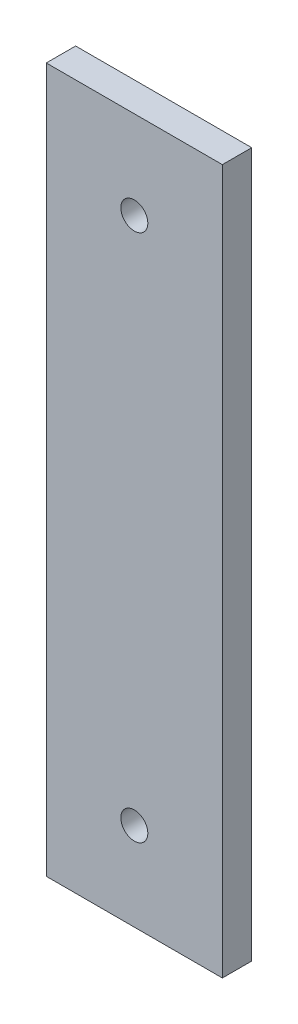
ISO-10303-21;
HEADER;
FILE_DESCRIPTION(('STEP AP214'),'2;1');
FILE_NAME('part.step','',(''),(''),'','','');
FILE_SCHEMA(('AUTOMOTIVE_DESIGN { 1 0 10303 214 1 1 1 1 }'));
ENDSEC;
DATA;
#1=APPLICATION_CONTEXT('core data for automotive mechanical design processes');
#2=APPLICATION_PROTOCOL_DEFINITION('international standard','automotive_design',2000,#1);
#3=PRODUCT_CONTEXT('',#1,'mechanical');
#4=PRODUCT('Part','Part','',(#3));
#5=PRODUCT_RELATED_PRODUCT_CATEGORY('part','',(#4));
#6=PRODUCT_DEFINITION_FORMATION('','',#4);
#7=PRODUCT_DEFINITION_CONTEXT('part definition',#1,'design');
#8=PRODUCT_DEFINITION('design','',#6,#7);
#9=PRODUCT_DEFINITION_SHAPE('','',#8);
#10=(LENGTH_UNIT() NAMED_UNIT(*) SI_UNIT(.MILLI.,.METRE.));
#11=(NAMED_UNIT(*) PLANE_ANGLE_UNIT() SI_UNIT($,.RADIAN.));
#12=(NAMED_UNIT(*) SI_UNIT($,.STERADIAN.) SOLID_ANGLE_UNIT());
#13=UNCERTAINTY_MEASURE_WITH_UNIT(LENGTH_MEASURE(1.E-05),#10,'distance_accuracy_value','');
#14=(GEOMETRIC_REPRESENTATION_CONTEXT(3) GLOBAL_UNCERTAINTY_ASSIGNED_CONTEXT((#13)) GLOBAL_UNIT_ASSIGNED_CONTEXT((#10,
#11,#12)) REPRESENTATION_CONTEXT('',''));
#15=CARTESIAN_POINT('',(0.,0.,0.));
#16=DIRECTION('',(0.,0.,1.));
#17=DIRECTION('',(1.,0.,0.));
#18=AXIS2_PLACEMENT_3D('',#15,#16,#17);
#19=CARTESIAN_POINT('',(0.,0.,3.175));
#20=DIRECTION('',(1.,0.,0.));
#21=DIRECTION('',(0.,1.,0.));
#22=AXIS2_PLACEMENT_3D('',#19,#20,#21);
#23=PLANE('',#22);
#24=DIRECTION('',(0.,-1.,0.));
#25=VECTOR('',#24,1.);
#26=CARTESIAN_POINT('',(0.,0.,0.));
#27=LINE('',#26,#25);
#28=CARTESIAN_POINT('',(0.,76.2,0.));
#29=VERTEX_POINT('',#28);
#30=CARTESIAN_POINT('',(0.,0.,0.));
#31=VERTEX_POINT('',#30);
#32=EDGE_CURVE('E112',#29,#31,#27,.T.);
#33=ORIENTED_EDGE('',*,*,#32,.T.);
#34=DIRECTION('',(0.,0.,-1.));
#35=VECTOR('',#34,1.);
#36=CARTESIAN_POINT('',(0.,0.,3.175));
#37=LINE('',#36,#35);
#38=CARTESIAN_POINT('',(0.,0.,3.175));
#39=VERTEX_POINT('',#38);
#40=EDGE_CURVE('E11',#39,#31,#37,.T.);
#41=ORIENTED_EDGE('',*,*,#40,.F.);
#42=DIRECTION('',(0.,-1.,0.));
#43=VECTOR('',#42,1.);
#44=CARTESIAN_POINT('',(0.,0.,3.175));
#45=LINE('',#44,#43);
#46=CARTESIAN_POINT('',(0.,76.2,3.175));
#47=VERTEX_POINT('',#46);
#48=EDGE_CURVE('E96',#47,#39,#45,.T.);
#49=ORIENTED_EDGE('',*,*,#48,.F.);
#50=DIRECTION('',(0.,0.,-1.));
#51=VECTOR('',#50,1.);
#52=CARTESIAN_POINT('',(0.,76.2,3.175));
#53=LINE('',#52,#51);
#54=EDGE_CURVE('E108',#47,#29,#53,.T.);
#55=ORIENTED_EDGE('',*,*,#54,.T.);
#56=EDGE_LOOP('',(#33,#41,#49,#55));
#57=FACE_BOUND('',#56,.T.);
#58=ADVANCED_FACE('F44',(#57),#23,.F.);
#59=CARTESIAN_POINT('',(0.,0.,3.175));
#60=DIRECTION('',(0.,1.,0.));
#61=DIRECTION('',(0.,0.,1.));
#62=AXIS2_PLACEMENT_3D('',#59,#60,#61);
#63=PLANE('',#62);
#64=DIRECTION('',(1.,0.,0.));
#65=VECTOR('',#64,1.);
#66=CARTESIAN_POINT('',(0.,0.,0.));
#67=LINE('',#66,#65);
#68=CARTESIAN_POINT('',(19.05,0.,0.));
#69=VERTEX_POINT('',#68);
#70=EDGE_CURVE('E101',#31,#69,#67,.T.);
#71=ORIENTED_EDGE('',*,*,#70,.T.);
#72=DIRECTION('',(0.,0.,-1.));
#73=VECTOR('',#72,1.);
#74=CARTESIAN_POINT('',(19.05,0.,3.175));
#75=LINE('',#74,#73);
#76=CARTESIAN_POINT('',(19.05,0.,3.175));
#77=VERTEX_POINT('',#76);
#78=EDGE_CURVE('E53',#77,#69,#75,.T.);
#79=ORIENTED_EDGE('',*,*,#78,.F.);
#80=DIRECTION('',(1.,0.,0.));
#81=VECTOR('',#80,1.);
#82=CARTESIAN_POINT('',(0.,0.,3.175));
#83=LINE('',#82,#81);
#84=EDGE_CURVE('E91',#39,#77,#83,.T.);
#85=ORIENTED_EDGE('',*,*,#84,.F.);
#86=ORIENTED_EDGE('',*,*,#40,.T.);
#87=EDGE_LOOP('',(#71,#79,#85,#86));
#88=FACE_BOUND('',#87,.T.);
#89=ADVANCED_FACE('F100',(#88),#63,.F.);
#90=CARTESIAN_POINT('',(19.05,0.,3.175));
#91=DIRECTION('',(-1.,0.,0.));
#92=DIRECTION('',(0.,-1.,0.));
#93=AXIS2_PLACEMENT_3D('',#90,#91,#92);
#94=PLANE('',#93);
#95=DIRECTION('',(0.,1.,0.));
#96=VECTOR('',#95,1.);
#97=CARTESIAN_POINT('',(19.05,0.,0.));
#98=LINE('',#97,#96);
#99=CARTESIAN_POINT('',(19.05,76.2,0.));
#100=VERTEX_POINT('',#99);
#101=EDGE_CURVE('E78',#69,#100,#98,.T.);
#102=ORIENTED_EDGE('',*,*,#101,.T.);
#103=DIRECTION('',(0.,0.,-1.));
#104=VECTOR('',#103,1.);
#105=CARTESIAN_POINT('',(19.05,76.2,3.175));
#106=LINE('',#105,#104);
#107=CARTESIAN_POINT('',(19.05,76.2,3.175));
#108=VERTEX_POINT('',#107);
#109=EDGE_CURVE('E103',#108,#100,#106,.T.);
#110=ORIENTED_EDGE('',*,*,#109,.F.);
#111=DIRECTION('',(0.,1.,0.));
#112=VECTOR('',#111,1.);
#113=CARTESIAN_POINT('',(19.05,0.,3.175));
#114=LINE('',#113,#112);
#115=EDGE_CURVE('E94',#77,#108,#114,.T.);
#116=ORIENTED_EDGE('',*,*,#115,.F.);
#117=ORIENTED_EDGE('',*,*,#78,.T.);
#118=EDGE_LOOP('',(#102,#110,#116,#117));
#119=FACE_BOUND('',#118,.T.);
#120=ADVANCED_FACE('F104',(#119),#94,.F.);
#121=CARTESIAN_POINT('',(0.,76.2,3.175));
#122=DIRECTION('',(0.,-1.,0.));
#123=DIRECTION('',(0.,0.,-1.));
#124=AXIS2_PLACEMENT_3D('',#121,#122,#123);
#125=PLANE('',#124);
#126=DIRECTION('',(-1.,0.,0.));
#127=VECTOR('',#126,1.);
#128=CARTESIAN_POINT('',(0.,76.2,0.));
#129=LINE('',#128,#127);
#130=EDGE_CURVE('E84',#100,#29,#129,.T.);
#131=ORIENTED_EDGE('',*,*,#130,.T.);
#132=ORIENTED_EDGE('',*,*,#54,.F.);
#133=DIRECTION('',(-1.,0.,0.));
#134=VECTOR('',#133,1.);
#135=CARTESIAN_POINT('',(0.,76.2,3.175));
#136=LINE('',#135,#134);
#137=EDGE_CURVE('E61',#108,#47,#136,.T.);
#138=ORIENTED_EDGE('',*,*,#137,.F.);
#139=ORIENTED_EDGE('',*,*,#109,.T.);
#140=EDGE_LOOP('',(#131,#132,#138,#139));
#141=FACE_BOUND('',#140,.T.);
#142=ADVANCED_FACE('F126',(#141),#125,.F.);
#143=CARTESIAN_POINT('',(0.,0.,3.175));
#144=DIRECTION('',(0.,0.,-1.));
#145=DIRECTION('',(-1.,0.,0.));
#146=AXIS2_PLACEMENT_3D('',#143,#144,#145);
#147=PLANE('',#146);
#148=CARTESIAN_POINT('',(9.52499999999999,66.675,3.175));
#149=DIRECTION('',(0.,0.,1.));
#150=DIRECTION('',(1.,0.,0.));
#151=AXIS2_PLACEMENT_3D('',#148,#149,#150);
#152=CIRCLE('',#151,1.4605);
#153=CARTESIAN_POINT('',(10.9855,66.675,3.175));
#154=VERTEX_POINT('',#153);
#155=EDGE_CURVE('E141',#154,#154,#152,.T.);
#156=ORIENTED_EDGE('',*,*,#155,.F.);
#157=EDGE_LOOP('',(#156));
#158=FACE_BOUND('',#157,.T.);
#159=CARTESIAN_POINT('',(9.52499999999999,9.525,3.175));
#160=DIRECTION('',(0.,0.,1.));
#161=DIRECTION('',(1.,0.,0.));
#162=AXIS2_PLACEMENT_3D('',#159,#160,#161);
#163=CIRCLE('',#162,1.4605);
#164=CARTESIAN_POINT('',(10.9855,9.525,3.175));
#165=VERTEX_POINT('',#164);
#166=EDGE_CURVE('E137',#165,#165,#163,.T.);
#167=ORIENTED_EDGE('',*,*,#166,.F.);
#168=EDGE_LOOP('',(#167));
#169=FACE_BOUND('',#168,.T.);
#170=ORIENTED_EDGE('',*,*,#48,.T.);
#171=ORIENTED_EDGE('',*,*,#84,.T.);
#172=ORIENTED_EDGE('',*,*,#115,.T.);
#173=ORIENTED_EDGE('',*,*,#137,.T.);
#174=EDGE_LOOP('',(#170,#171,#172,#173));
#175=FACE_BOUND('',#174,.T.);
#176=ADVANCED_FACE('F92',(#158,#169,#175),#147,.F.);
#177=CARTESIAN_POINT('',(0.,0.,0.));
#178=DIRECTION('',(0.,0.,-1.));
#179=DIRECTION('',(-1.,0.,0.));
#180=AXIS2_PLACEMENT_3D('',#177,#178,#179);
#181=PLANE('',#180);
#182=CARTESIAN_POINT('',(9.52499999999999,66.675,0.));
#183=DIRECTION('',(0.,0.,1.));
#184=DIRECTION('',(1.,0.,0.));
#185=AXIS2_PLACEMENT_3D('',#182,#183,#184);
#186=CIRCLE('',#185,1.4605);
#187=CARTESIAN_POINT('',(10.9855,66.675,0.));
#188=VERTEX_POINT('',#187);
#189=EDGE_CURVE('E116',#188,#188,#186,.T.);
#190=ORIENTED_EDGE('',*,*,#189,.T.);
#191=EDGE_LOOP('',(#190));
#192=FACE_BOUND('',#191,.T.);
#193=CARTESIAN_POINT('',(9.52499999999999,9.525,0.));
#194=DIRECTION('',(0.,0.,1.));
#195=DIRECTION('',(1.,0.,0.));
#196=AXIS2_PLACEMENT_3D('',#193,#194,#195);
#197=CIRCLE('',#196,1.4605);
#198=CARTESIAN_POINT('',(10.9855,9.525,0.));
#199=VERTEX_POINT('',#198);
#200=EDGE_CURVE('E133',#199,#199,#197,.T.);
#201=ORIENTED_EDGE('',*,*,#200,.T.);
#202=EDGE_LOOP('',(#201));
#203=FACE_BOUND('',#202,.T.);
#204=ORIENTED_EDGE('',*,*,#32,.F.);
#205=ORIENTED_EDGE('',*,*,#130,.F.);
#206=ORIENTED_EDGE('',*,*,#101,.F.);
#207=ORIENTED_EDGE('',*,*,#70,.F.);
#208=EDGE_LOOP('',(#204,#205,#206,#207));
#209=FACE_BOUND('',#208,.T.);
#210=ADVANCED_FACE('F129',(#192,#203,#209),#181,.T.);
#211=CARTESIAN_POINT('',(9.52499999999999,9.525,0.));
#212=DIRECTION('',(0.,0.,1.));
#213=DIRECTION('',(1.,0.,0.));
#214=AXIS2_PLACEMENT_3D('',#211,#212,#213);
#215=CYLINDRICAL_SURFACE('',#214,1.4605);
#216=ORIENTED_EDGE('',*,*,#200,.F.);
#217=EDGE_LOOP('',(#216));
#218=FACE_BOUND('',#217,.T.);
#219=ORIENTED_EDGE('',*,*,#166,.T.);
#220=EDGE_LOOP('',(#219));
#221=FACE_BOUND('',#220,.T.);
#222=ADVANCED_FACE('F154',(#218,#221),#215,.F.);
#223=CARTESIAN_POINT('',(9.52499999999999,66.675,0.));
#224=DIRECTION('',(0.,0.,1.));
#225=DIRECTION('',(1.,0.,0.));
#226=AXIS2_PLACEMENT_3D('',#223,#224,#225);
#227=CYLINDRICAL_SURFACE('',#226,1.4605);
#228=ORIENTED_EDGE('',*,*,#189,.F.);
#229=EDGE_LOOP('',(#228));
#230=FACE_BOUND('',#229,.T.);
#231=ORIENTED_EDGE('',*,*,#155,.T.);
#232=EDGE_LOOP('',(#231));
#233=FACE_BOUND('',#232,.T.);
#234=ADVANCED_FACE('F151',(#230,#233),#227,.F.);
#235=CLOSED_SHELL('',(#58,#89,#120,#142,#176,#210,#222,#234));
#236=MANIFOLD_SOLID_BREP('B2',#235);
#237=ADVANCED_BREP_SHAPE_REPRESENTATION('',(#18,#236),#14);
#238=SHAPE_DEFINITION_REPRESENTATION(#9,#237);
ENDSEC;
END-ISO-10303-21;
